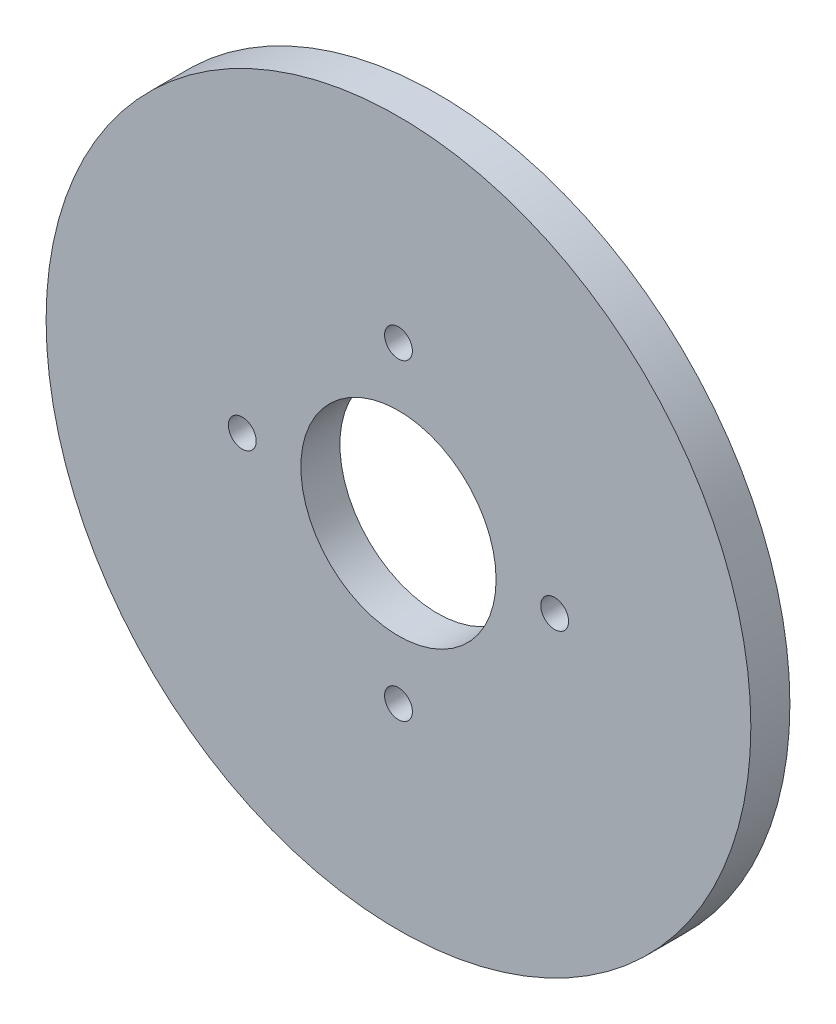
ISO-10303-21;
HEADER;
FILE_DESCRIPTION(('STEP AP214'),'2;1');
FILE_NAME('part.step','',(''),(''),'','','');
FILE_SCHEMA(('AUTOMOTIVE_DESIGN { 1 0 10303 214 1 1 1 1 }'));
ENDSEC;
DATA;
#1=APPLICATION_CONTEXT('core data for automotive mechanical design processes');
#2=APPLICATION_PROTOCOL_DEFINITION('international standard','automotive_design',2000,#1);
#3=PRODUCT_CONTEXT('',#1,'mechanical');
#4=PRODUCT('Part','Part','',(#3));
#5=PRODUCT_RELATED_PRODUCT_CATEGORY('part','',(#4));
#6=PRODUCT_DEFINITION_FORMATION('','',#4);
#7=PRODUCT_DEFINITION_CONTEXT('part definition',#1,'design');
#8=PRODUCT_DEFINITION('design','',#6,#7);
#9=PRODUCT_DEFINITION_SHAPE('','',#8);
#10=(LENGTH_UNIT() NAMED_UNIT(*) SI_UNIT(.MILLI.,.METRE.));
#11=(NAMED_UNIT(*) PLANE_ANGLE_UNIT() SI_UNIT($,.RADIAN.));
#12=(NAMED_UNIT(*) SI_UNIT($,.STERADIAN.) SOLID_ANGLE_UNIT());
#13=UNCERTAINTY_MEASURE_WITH_UNIT(LENGTH_MEASURE(1.E-05),#10,'distance_accuracy_value','');
#14=(GEOMETRIC_REPRESENTATION_CONTEXT(3) GLOBAL_UNCERTAINTY_ASSIGNED_CONTEXT((#13)) GLOBAL_UNIT_ASSIGNED_CONTEXT((#10,
#11,#12)) REPRESENTATION_CONTEXT('',''));
#15=CARTESIAN_POINT('',(0.,0.,0.));
#16=DIRECTION('',(0.,0.,1.));
#17=DIRECTION('',(1.,0.,0.));
#18=AXIS2_PLACEMENT_3D('',#15,#16,#17);
#19=CARTESIAN_POINT('',(0.,0.,3.175));
#20=DIRECTION('',(0.,0.,1.));
#21=DIRECTION('',(1.,0.,0.));
#22=AXIS2_PLACEMENT_3D('',#19,#20,#21);
#23=PLANE('',#22);
#24=CARTESIAN_POINT('',(0.,12.7,3.175));
#25=DIRECTION('',(0.,0.,1.));
#26=DIRECTION('',(1.,0.,0.));
#27=AXIS2_PLACEMENT_3D('',#24,#25,#26);
#28=CIRCLE('',#27,1.1303);
#29=CARTESIAN_POINT('',(1.1303,12.7,3.175));
#30=VERTEX_POINT('',#29);
#31=EDGE_CURVE('E100',#30,#30,#28,.T.);
#32=ORIENTED_EDGE('',*,*,#31,.F.);
#33=EDGE_LOOP('',(#32));
#34=FACE_BOUND('',#33,.T.);
#35=CARTESIAN_POINT('',(0.,-12.7,3.175));
#36=DIRECTION('',(0.,0.,1.));
#37=DIRECTION('',(1.,0.,0.));
#38=AXIS2_PLACEMENT_3D('',#35,#36,#37);
#39=CIRCLE('',#38,1.1303);
#40=CARTESIAN_POINT('',(1.1303,-12.7,3.175));
#41=VERTEX_POINT('',#40);
#42=EDGE_CURVE('E65',#41,#41,#39,.T.);
#43=ORIENTED_EDGE('',*,*,#42,.F.);
#44=EDGE_LOOP('',(#43));
#45=FACE_BOUND('',#44,.T.);
#46=CARTESIAN_POINT('',(12.7,0.,3.175));
#47=DIRECTION('',(0.,0.,1.));
#48=DIRECTION('',(1.,0.,0.));
#49=AXIS2_PLACEMENT_3D('',#46,#47,#48);
#50=CIRCLE('',#49,1.1303);
#51=CARTESIAN_POINT('',(13.8303,0.,3.175));
#52=VERTEX_POINT('',#51);
#53=EDGE_CURVE('E54',#52,#52,#50,.T.);
#54=ORIENTED_EDGE('',*,*,#53,.F.);
#55=EDGE_LOOP('',(#54));
#56=FACE_BOUND('',#55,.T.);
#57=CARTESIAN_POINT('',(-12.7,0.,3.175));
#58=DIRECTION('',(0.,0.,1.));
#59=DIRECTION('',(1.,0.,0.));
#60=AXIS2_PLACEMENT_3D('',#57,#58,#59);
#61=CIRCLE('',#60,1.1303);
#62=CARTESIAN_POINT('',(-11.5697,0.,3.175));
#63=VERTEX_POINT('',#62);
#64=EDGE_CURVE('E53',#63,#63,#61,.T.);
#65=ORIENTED_EDGE('',*,*,#64,.F.);
#66=EDGE_LOOP('',(#65));
#67=FACE_BOUND('',#66,.T.);
#68=CARTESIAN_POINT('',(0.,0.,3.175));
#69=DIRECTION('',(0.,0.,1.));
#70=DIRECTION('',(1.,0.,0.));
#71=AXIS2_PLACEMENT_3D('',#68,#69,#70);
#72=CIRCLE('',#71,28.6512);
#73=CARTESIAN_POINT('',(28.6512,0.,3.175));
#74=VERTEX_POINT('',#73);
#75=EDGE_CURVE('E10',#74,#74,#72,.T.);
#76=ORIENTED_EDGE('',*,*,#75,.T.);
#77=EDGE_LOOP('',(#76));
#78=FACE_BOUND('',#77,.T.);
#79=CARTESIAN_POINT('',(0.,0.,3.175));
#80=DIRECTION('',(0.,0.,1.));
#81=DIRECTION('',(1.,0.,0.));
#82=AXIS2_PLACEMENT_3D('',#79,#80,#81);
#83=CIRCLE('',#82,7.9375);
#84=CARTESIAN_POINT('',(7.9375,0.,3.175));
#85=VERTEX_POINT('',#84);
#86=EDGE_CURVE('E46',#85,#85,#83,.T.);
#87=ORIENTED_EDGE('',*,*,#86,.F.);
#88=EDGE_LOOP('',(#87));
#89=FACE_BOUND('',#88,.T.);
#90=ADVANCED_FACE('F33',(#34,#45,#56,#67,#78,#89),#23,.T.);
#91=CARTESIAN_POINT('',(0.,0.,0.));
#92=DIRECTION('',(0.,0.,1.));
#93=DIRECTION('',(1.,0.,0.));
#94=AXIS2_PLACEMENT_3D('',#91,#92,#93);
#95=PLANE('',#94);
#96=CARTESIAN_POINT('',(0.,12.7,0.));
#97=DIRECTION('',(0.,0.,1.));
#98=DIRECTION('',(1.,0.,0.));
#99=AXIS2_PLACEMENT_3D('',#96,#97,#98);
#100=CIRCLE('',#99,1.1303);
#101=CARTESIAN_POINT('',(1.1303,12.7,0.));
#102=VERTEX_POINT('',#101);
#103=EDGE_CURVE('E114',#102,#102,#100,.T.);
#104=ORIENTED_EDGE('',*,*,#103,.T.);
#105=EDGE_LOOP('',(#104));
#106=FACE_BOUND('',#105,.T.);
#107=CARTESIAN_POINT('',(0.,-12.7,0.));
#108=DIRECTION('',(0.,0.,1.));
#109=DIRECTION('',(1.,0.,0.));
#110=AXIS2_PLACEMENT_3D('',#107,#108,#109);
#111=CIRCLE('',#110,1.1303);
#112=CARTESIAN_POINT('',(1.1303,-12.7,0.));
#113=VERTEX_POINT('',#112);
#114=EDGE_CURVE('E37',#113,#113,#111,.T.);
#115=ORIENTED_EDGE('',*,*,#114,.T.);
#116=EDGE_LOOP('',(#115));
#117=FACE_BOUND('',#116,.T.);
#118=CARTESIAN_POINT('',(12.7,0.,0.));
#119=DIRECTION('',(0.,0.,1.));
#120=DIRECTION('',(1.,0.,0.));
#121=AXIS2_PLACEMENT_3D('',#118,#119,#120);
#122=CIRCLE('',#121,1.1303);
#123=CARTESIAN_POINT('',(13.8303,0.,0.));
#124=VERTEX_POINT('',#123);
#125=EDGE_CURVE('E51',#124,#124,#122,.T.);
#126=ORIENTED_EDGE('',*,*,#125,.T.);
#127=EDGE_LOOP('',(#126));
#128=FACE_BOUND('',#127,.T.);
#129=CARTESIAN_POINT('',(-12.7,0.,0.));
#130=DIRECTION('',(0.,0.,1.));
#131=DIRECTION('',(1.,0.,0.));
#132=AXIS2_PLACEMENT_3D('',#129,#130,#131);
#133=CIRCLE('',#132,1.1303);
#134=CARTESIAN_POINT('',(-11.5697,0.,0.));
#135=VERTEX_POINT('',#134);
#136=EDGE_CURVE('E58',#135,#135,#133,.T.);
#137=ORIENTED_EDGE('',*,*,#136,.T.);
#138=EDGE_LOOP('',(#137));
#139=FACE_BOUND('',#138,.T.);
#140=CARTESIAN_POINT('',(0.,0.,0.));
#141=DIRECTION('',(0.,0.,1.));
#142=DIRECTION('',(1.,0.,0.));
#143=AXIS2_PLACEMENT_3D('',#140,#141,#142);
#144=CIRCLE('',#143,28.6512);
#145=CARTESIAN_POINT('',(28.6512,0.,0.));
#146=VERTEX_POINT('',#145);
#147=EDGE_CURVE('E41',#146,#146,#144,.T.);
#148=ORIENTED_EDGE('',*,*,#147,.F.);
#149=EDGE_LOOP('',(#148));
#150=FACE_BOUND('',#149,.T.);
#151=CARTESIAN_POINT('',(0.,0.,0.));
#152=DIRECTION('',(0.,0.,1.));
#153=DIRECTION('',(1.,0.,0.));
#154=AXIS2_PLACEMENT_3D('',#151,#152,#153);
#155=CIRCLE('',#154,7.9375);
#156=CARTESIAN_POINT('',(7.9375,0.,0.));
#157=VERTEX_POINT('',#156);
#158=EDGE_CURVE('E49',#157,#157,#155,.T.);
#159=ORIENTED_EDGE('',*,*,#158,.T.);
#160=EDGE_LOOP('',(#159));
#161=FACE_BOUND('',#160,.T.);
#162=ADVANCED_FACE('F76',(#106,#117,#128,#139,#150,#161),#95,.F.);
#163=CARTESIAN_POINT('',(0.,0.,3.175));
#164=DIRECTION('',(0.,0.,-1.));
#165=DIRECTION('',(-1.,0.,0.));
#166=AXIS2_PLACEMENT_3D('',#163,#164,#165);
#167=CYLINDRICAL_SURFACE('',#166,28.6512);
#168=ORIENTED_EDGE('',*,*,#75,.F.);
#169=EDGE_LOOP('',(#168));
#170=FACE_BOUND('',#169,.T.);
#171=ORIENTED_EDGE('',*,*,#147,.T.);
#172=EDGE_LOOP('',(#171));
#173=FACE_BOUND('',#172,.T.);
#174=ADVANCED_FACE('F35',(#170,#173),#167,.T.);
#175=CARTESIAN_POINT('',(0.,0.,3.175));
#176=DIRECTION('',(0.,0.,-1.));
#177=DIRECTION('',(-1.,0.,0.));
#178=AXIS2_PLACEMENT_3D('',#175,#176,#177);
#179=CYLINDRICAL_SURFACE('',#178,7.9375);
#180=ORIENTED_EDGE('',*,*,#86,.T.);
#181=EDGE_LOOP('',(#180));
#182=FACE_BOUND('',#181,.T.);
#183=ORIENTED_EDGE('',*,*,#158,.F.);
#184=EDGE_LOOP('',(#183));
#185=FACE_BOUND('',#184,.T.);
#186=ADVANCED_FACE('F78',(#182,#185),#179,.F.);
#187=CARTESIAN_POINT('',(-12.7,0.,3.175));
#188=DIRECTION('',(0.,0.,1.));
#189=DIRECTION('',(1.,0.,0.));
#190=AXIS2_PLACEMENT_3D('',#187,#188,#189);
#191=CYLINDRICAL_SURFACE('',#190,1.1303);
#192=ORIENTED_EDGE('',*,*,#64,.T.);
#193=EDGE_LOOP('',(#192));
#194=FACE_BOUND('',#193,.T.);
#195=ORIENTED_EDGE('',*,*,#136,.F.);
#196=EDGE_LOOP('',(#195));
#197=FACE_BOUND('',#196,.T.);
#198=ADVANCED_FACE('F80',(#194,#197),#191,.F.);
#199=CARTESIAN_POINT('',(12.7,0.,3.175));
#200=DIRECTION('',(0.,0.,1.));
#201=DIRECTION('',(1.,0.,0.));
#202=AXIS2_PLACEMENT_3D('',#199,#200,#201);
#203=CYLINDRICAL_SURFACE('',#202,1.1303);
#204=ORIENTED_EDGE('',*,*,#53,.T.);
#205=EDGE_LOOP('',(#204));
#206=FACE_BOUND('',#205,.T.);
#207=ORIENTED_EDGE('',*,*,#125,.F.);
#208=EDGE_LOOP('',(#207));
#209=FACE_BOUND('',#208,.T.);
#210=ADVANCED_FACE('F86',(#206,#209),#203,.F.);
#211=CARTESIAN_POINT('',(0.,-12.7,3.175));
#212=DIRECTION('',(0.,0.,1.));
#213=DIRECTION('',(1.,0.,0.));
#214=AXIS2_PLACEMENT_3D('',#211,#212,#213);
#215=CYLINDRICAL_SURFACE('',#214,1.1303);
#216=ORIENTED_EDGE('',*,*,#42,.T.);
#217=EDGE_LOOP('',(#216));
#218=FACE_BOUND('',#217,.T.);
#219=ORIENTED_EDGE('',*,*,#114,.F.);
#220=EDGE_LOOP('',(#219));
#221=FACE_BOUND('',#220,.T.);
#222=ADVANCED_FACE('F122',(#218,#221),#215,.F.);
#223=CARTESIAN_POINT('',(0.,12.7,3.175));
#224=DIRECTION('',(0.,0.,1.));
#225=DIRECTION('',(1.,0.,0.));
#226=AXIS2_PLACEMENT_3D('',#223,#224,#225);
#227=CYLINDRICAL_SURFACE('',#226,1.1303);
#228=ORIENTED_EDGE('',*,*,#31,.T.);
#229=EDGE_LOOP('',(#228));
#230=FACE_BOUND('',#229,.T.);
#231=ORIENTED_EDGE('',*,*,#103,.F.);
#232=EDGE_LOOP('',(#231));
#233=FACE_BOUND('',#232,.T.);
#234=ADVANCED_FACE('F119',(#230,#233),#227,.F.);
#235=CLOSED_SHELL('',(#90,#162,#174,#186,#198,#210,#222,#234));
#236=MANIFOLD_SOLID_BREP('B2',#235);
#237=ADVANCED_BREP_SHAPE_REPRESENTATION('',(#18,#236),#14);
#238=SHAPE_DEFINITION_REPRESENTATION(#9,#237);
ENDSEC;
END-ISO-10303-21;
